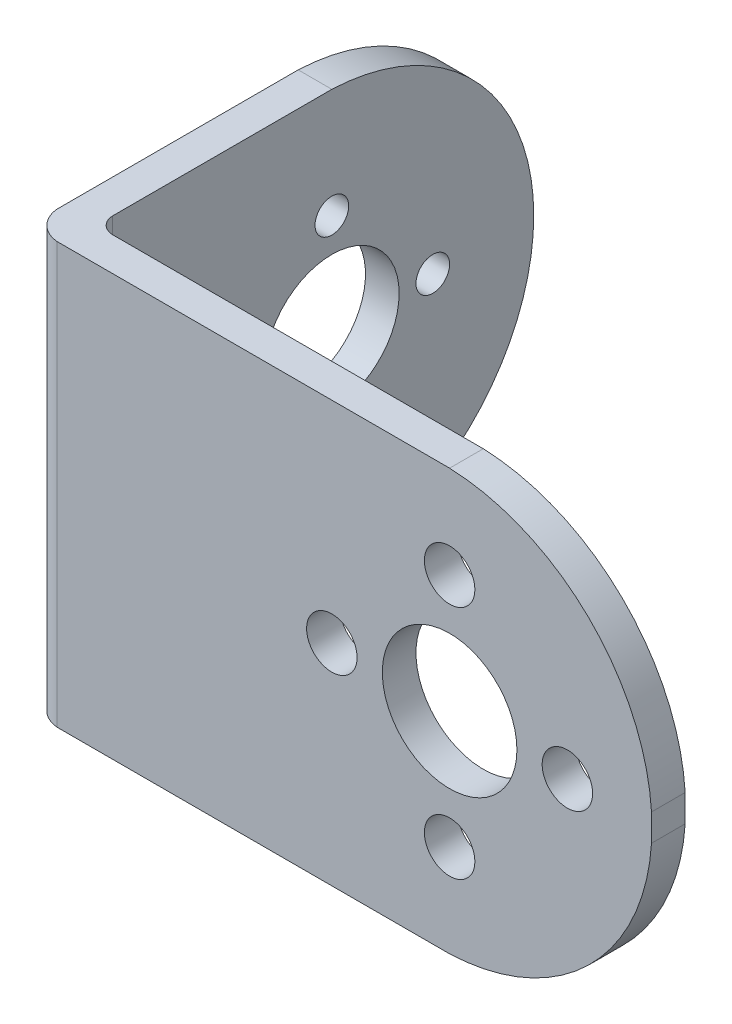
ISO-10303-21;
HEADER;
FILE_DESCRIPTION(('STEP AP214'),'2;1');
FILE_NAME('part.step','',(''),(''),'','','');
FILE_SCHEMA(('AUTOMOTIVE_DESIGN { 1 0 10303 214 1 1 1 1 }'));
ENDSEC;
DATA;
#1=APPLICATION_CONTEXT('core data for automotive mechanical design processes');
#2=APPLICATION_PROTOCOL_DEFINITION('international standard','automotive_design',2000,#1);
#3=PRODUCT_CONTEXT('',#1,'mechanical');
#4=PRODUCT('Part','Part','',(#3));
#5=PRODUCT_RELATED_PRODUCT_CATEGORY('part','',(#4));
#6=PRODUCT_DEFINITION_FORMATION('','',#4);
#7=PRODUCT_DEFINITION_CONTEXT('part definition',#1,'design');
#8=PRODUCT_DEFINITION('design','',#6,#7);
#9=PRODUCT_DEFINITION_SHAPE('','',#8);
#10=(LENGTH_UNIT() NAMED_UNIT(*) SI_UNIT(.MILLI.,.METRE.));
#11=(NAMED_UNIT(*) PLANE_ANGLE_UNIT() SI_UNIT($,.RADIAN.));
#12=(NAMED_UNIT(*) SI_UNIT($,.STERADIAN.) SOLID_ANGLE_UNIT());
#13=UNCERTAINTY_MEASURE_WITH_UNIT(LENGTH_MEASURE(1.E-05),#10,'distance_accuracy_value','');
#14=(GEOMETRIC_REPRESENTATION_CONTEXT(3) GLOBAL_UNCERTAINTY_ASSIGNED_CONTEXT((#13)) GLOBAL_UNIT_ASSIGNED_CONTEXT((#10,
#11,#12)) REPRESENTATION_CONTEXT('',''));
#15=CARTESIAN_POINT('',(0.,0.,0.));
#16=DIRECTION('',(0.,0.,1.));
#17=DIRECTION('',(1.,0.,0.));
#18=AXIS2_PLACEMENT_3D('',#15,#16,#17);
#19=CARTESIAN_POINT('',(0.,25.,0.));
#20=DIRECTION('',(0.,0.,-1.));
#21=DIRECTION('',(-1.,0.,0.));
#22=AXIS2_PLACEMENT_3D('',#19,#20,#21);
#23=PLANE('',#22);
#24=CARTESIAN_POINT('',(25.,19.5,0.));
#25=DIRECTION('',(0.,0.,1.));
#26=DIRECTION('',(1.,0.,0.));
#27=AXIS2_PLACEMENT_3D('',#24,#25,#26);
#28=CIRCLE('',#27,1.5);
#29=CARTESIAN_POINT('',(26.5,19.5,0.));
#30=VERTEX_POINT('',#29);
#31=EDGE_CURVE('E309',#30,#30,#28,.T.);
#32=ORIENTED_EDGE('',*,*,#31,.F.);
#33=EDGE_LOOP('',(#32));
#34=FACE_BOUND('',#33,.T.);
#35=CARTESIAN_POINT('',(32.0000000000001,12.5000000000001,0.));
#36=DIRECTION('',(0.,0.,1.));
#37=DIRECTION('',(1.,0.,0.));
#38=AXIS2_PLACEMENT_3D('',#35,#36,#37);
#39=CIRCLE('',#38,1.5);
#40=CARTESIAN_POINT('',(33.5000000000001,12.5000000000001,0.));
#41=VERTEX_POINT('',#40);
#42=EDGE_CURVE('E306',#41,#41,#39,.T.);
#43=ORIENTED_EDGE('',*,*,#42,.F.);
#44=EDGE_LOOP('',(#43));
#45=FACE_BOUND('',#44,.T.);
#46=CARTESIAN_POINT('',(25.0000000000002,5.5,0.));
#47=DIRECTION('',(0.,0.,1.));
#48=DIRECTION('',(1.,0.,0.));
#49=AXIS2_PLACEMENT_3D('',#46,#47,#48);
#50=CIRCLE('',#49,1.5);
#51=CARTESIAN_POINT('',(26.5000000000002,5.5,0.));
#52=VERTEX_POINT('',#51);
#53=EDGE_CURVE('E303',#52,#52,#50,.T.);
#54=ORIENTED_EDGE('',*,*,#53,.F.);
#55=EDGE_LOOP('',(#54));
#56=FACE_BOUND('',#55,.T.);
#57=CARTESIAN_POINT('',(18.0000000000001,12.5,0.));
#58=DIRECTION('',(0.,0.,1.));
#59=DIRECTION('',(1.,0.,0.));
#60=AXIS2_PLACEMENT_3D('',#57,#58,#59);
#61=CIRCLE('',#60,1.5);
#62=CARTESIAN_POINT('',(19.5000000000001,12.5,0.));
#63=VERTEX_POINT('',#62);
#64=EDGE_CURVE('E302',#63,#63,#61,.T.);
#65=ORIENTED_EDGE('',*,*,#64,.F.);
#66=EDGE_LOOP('',(#65));
#67=FACE_BOUND('',#66,.T.);
#68=CARTESIAN_POINT('',(25.,12.5,0.));
#69=DIRECTION('',(0.,0.,1.));
#70=DIRECTION('',(1.,0.,0.));
#71=AXIS2_PLACEMENT_3D('',#68,#69,#70);
#72=CIRCLE('',#71,4.);
#73=CARTESIAN_POINT('',(29.,12.5,0.));
#74=VERTEX_POINT('',#73);
#75=EDGE_CURVE('E160',#74,#74,#72,.T.);
#76=ORIENTED_EDGE('',*,*,#75,.F.);
#77=EDGE_LOOP('',(#76));
#78=FACE_BOUND('',#77,.T.);
#79=CARTESIAN_POINT('',(24.5166193979498,12.5,0.));
#80=DIRECTION('',(0.,0.,1.));
#81=DIRECTION('',(1.,0.,0.));
#82=AXIS2_PLACEMENT_3D('',#79,#80,#81);
#83=CIRCLE('',#82,12.5093427807554);
#84=CARTESIAN_POINT('',(37.,13.3055219120512,0.));
#85=VERTEX_POINT('',#84);
#86=CARTESIAN_POINT('',(25.,25.,0.));
#87=VERTEX_POINT('',#86);
#88=EDGE_CURVE('E116',#85,#87,#83,.T.);
#89=ORIENTED_EDGE('',*,*,#88,.T.);
#90=DIRECTION('',(1.,0.,0.));
#91=VECTOR('',#90,1.);
#92=CARTESIAN_POINT('',(0.,25.,0.));
#93=LINE('',#92,#91);
#94=CARTESIAN_POINT('',(1.65907540690337,25.,0.));
#95=VERTEX_POINT('',#94);
#96=EDGE_CURVE('E193',#95,#87,#93,.T.);
#97=ORIENTED_EDGE('',*,*,#96,.F.);
#98=DIRECTION('',(0.,-1.,0.));
#99=VECTOR('',#98,1.);
#100=CARTESIAN_POINT('',(1.65907540690337,25.,0.));
#101=LINE('',#100,#99);
#102=CARTESIAN_POINT('',(1.65907540690337,0.,0.));
#103=VERTEX_POINT('',#102);
#104=EDGE_CURVE('E137',#95,#103,#101,.T.);
#105=ORIENTED_EDGE('',*,*,#104,.T.);
#106=DIRECTION('',(1.,0.,0.));
#107=VECTOR('',#106,1.);
#108=CARTESIAN_POINT('',(0.,0.,0.));
#109=LINE('',#108,#107);
#110=CARTESIAN_POINT('',(25.,0.,0.));
#111=VERTEX_POINT('',#110);
#112=EDGE_CURVE('E206',#103,#111,#109,.T.);
#113=ORIENTED_EDGE('',*,*,#112,.T.);
#114=CARTESIAN_POINT('',(24.5166193979498,12.5,0.));
#115=DIRECTION('',(0.,0.,1.));
#116=DIRECTION('',(1.,0.,0.));
#117=AXIS2_PLACEMENT_3D('',#114,#115,#116);
#118=CIRCLE('',#117,12.5093427807554);
#119=CARTESIAN_POINT('',(37.,11.6944780879488,0.));
#120=VERTEX_POINT('',#119);
#121=EDGE_CURVE('E64',#111,#120,#118,.T.);
#122=ORIENTED_EDGE('',*,*,#121,.T.);
#123=DIRECTION('',(0.,-1.,0.));
#124=VECTOR('',#123,1.);
#125=CARTESIAN_POINT('',(37.,25.,0.));
#126=LINE('',#125,#124);
#127=EDGE_CURVE('E131',#85,#120,#126,.T.);
#128=ORIENTED_EDGE('',*,*,#127,.F.);
#129=EDGE_LOOP('',(#89,#97,#105,#113,#122,#128));
#130=FACE_BOUND('',#129,.T.);
#131=ADVANCED_FACE('F40',(#34,#45,#56,#67,#78,#130),#23,.F.);
#132=CARTESIAN_POINT('',(37.,25.,0.));
#133=DIRECTION('',(-1.,0.,0.));
#134=DIRECTION('',(0.,0.,1.));
#135=AXIS2_PLACEMENT_3D('',#132,#133,#134);
#136=PLANE('',#135);
#137=DIRECTION('',(0.,0.,1.));
#138=VECTOR('',#137,1.);
#139=CARTESIAN_POINT('',(37.,13.3055219120512,-25.));
#140=LINE('',#139,#138);
#141=CARTESIAN_POINT('',(37.,13.3055219120512,-2.));
#142=VERTEX_POINT('',#141);
#143=EDGE_CURVE('E119',#142,#85,#140,.T.);
#144=ORIENTED_EDGE('',*,*,#143,.T.);
#145=ORIENTED_EDGE('',*,*,#127,.T.);
#146=DIRECTION('',(0.,0.,1.));
#147=VECTOR('',#146,1.);
#148=CARTESIAN_POINT('',(37.,11.6944780879488,-25.));
#149=LINE('',#148,#147);
#150=CARTESIAN_POINT('',(37.,11.6944780879488,-2.));
#151=VERTEX_POINT('',#150);
#152=EDGE_CURVE('E124',#151,#120,#149,.T.);
#153=ORIENTED_EDGE('',*,*,#152,.F.);
#154=DIRECTION('',(0.,-1.,0.));
#155=VECTOR('',#154,1.);
#156=CARTESIAN_POINT('',(37.,25.,-2.));
#157=LINE('',#156,#155);
#158=EDGE_CURVE('E133',#142,#151,#157,.T.);
#159=ORIENTED_EDGE('',*,*,#158,.F.);
#160=EDGE_LOOP('',(#144,#145,#153,#159));
#161=FACE_BOUND('',#160,.T.);
#162=ADVANCED_FACE('F129',(#161),#136,.F.);
#163=CARTESIAN_POINT('',(0.,25.,-2.));
#164=DIRECTION('',(0.,0.,1.));
#165=DIRECTION('',(1.,0.,0.));
#166=AXIS2_PLACEMENT_3D('',#163,#164,#165);
#167=PLANE('',#166);
#168=CARTESIAN_POINT('',(25.,19.5,-2.));
#169=DIRECTION('',(0.,0.,1.));
#170=DIRECTION('',(1.,0.,0.));
#171=AXIS2_PLACEMENT_3D('',#168,#169,#170);
#172=CIRCLE('',#171,1.5);
#173=CARTESIAN_POINT('',(26.5,19.5,-2.));
#174=VERTEX_POINT('',#173);
#175=EDGE_CURVE('E44',#174,#174,#172,.T.);
#176=ORIENTED_EDGE('',*,*,#175,.T.);
#177=EDGE_LOOP('',(#176));
#178=FACE_BOUND('',#177,.T.);
#179=CARTESIAN_POINT('',(32.0000000000001,12.5000000000001,-2.));
#180=DIRECTION('',(0.,0.,1.));
#181=DIRECTION('',(1.,0.,0.));
#182=AXIS2_PLACEMENT_3D('',#179,#180,#181);
#183=CIRCLE('',#182,1.5);
#184=CARTESIAN_POINT('',(33.5000000000001,12.5000000000001,-2.));
#185=VERTEX_POINT('',#184);
#186=EDGE_CURVE('E165',#185,#185,#183,.T.);
#187=ORIENTED_EDGE('',*,*,#186,.T.);
#188=EDGE_LOOP('',(#187));
#189=FACE_BOUND('',#188,.T.);
#190=CARTESIAN_POINT('',(25.0000000000002,5.5,-2.));
#191=DIRECTION('',(0.,0.,1.));
#192=DIRECTION('',(1.,0.,0.));
#193=AXIS2_PLACEMENT_3D('',#190,#191,#192);
#194=CIRCLE('',#193,1.5);
#195=CARTESIAN_POINT('',(26.5000000000002,5.5,-2.));
#196=VERTEX_POINT('',#195);
#197=EDGE_CURVE('E163',#196,#196,#194,.T.);
#198=ORIENTED_EDGE('',*,*,#197,.T.);
#199=EDGE_LOOP('',(#198));
#200=FACE_BOUND('',#199,.T.);
#201=CARTESIAN_POINT('',(18.0000000000001,12.5,-2.));
#202=DIRECTION('',(0.,0.,1.));
#203=DIRECTION('',(1.,0.,0.));
#204=AXIS2_PLACEMENT_3D('',#201,#202,#203);
#205=CIRCLE('',#204,1.5);
#206=CARTESIAN_POINT('',(19.5000000000001,12.5,-2.));
#207=VERTEX_POINT('',#206);
#208=EDGE_CURVE('E159',#207,#207,#205,.T.);
#209=ORIENTED_EDGE('',*,*,#208,.T.);
#210=EDGE_LOOP('',(#209));
#211=FACE_BOUND('',#210,.T.);
#212=CARTESIAN_POINT('',(25.,12.5,-2.));
#213=DIRECTION('',(0.,0.,1.));
#214=DIRECTION('',(1.,0.,0.));
#215=AXIS2_PLACEMENT_3D('',#212,#213,#214);
#216=CIRCLE('',#215,4.);
#217=CARTESIAN_POINT('',(29.,12.5,-2.));
#218=VERTEX_POINT('',#217);
#219=EDGE_CURVE('E156',#218,#218,#216,.T.);
#220=ORIENTED_EDGE('',*,*,#219,.T.);
#221=EDGE_LOOP('',(#220));
#222=FACE_BOUND('',#221,.T.);
#223=CARTESIAN_POINT('',(24.5166193979498,12.5,-2.));
#224=DIRECTION('',(0.,0.,1.));
#225=DIRECTION('',(1.,0.,0.));
#226=AXIS2_PLACEMENT_3D('',#223,#224,#225);
#227=CIRCLE('',#226,12.5093427807554);
#228=CARTESIAN_POINT('',(25.,25.,-2.));
#229=VERTEX_POINT('',#228);
#230=EDGE_CURVE('E57',#142,#229,#227,.T.);
#231=ORIENTED_EDGE('',*,*,#230,.F.);
#232=ORIENTED_EDGE('',*,*,#158,.T.);
#233=CARTESIAN_POINT('',(24.5166193979498,12.5,-2.));
#234=DIRECTION('',(0.,0.,1.));
#235=DIRECTION('',(1.,0.,0.));
#236=AXIS2_PLACEMENT_3D('',#233,#234,#235);
#237=CIRCLE('',#236,12.5093427807554);
#238=CARTESIAN_POINT('',(25.,0.,-2.));
#239=VERTEX_POINT('',#238);
#240=EDGE_CURVE('E134',#239,#151,#237,.T.);
#241=ORIENTED_EDGE('',*,*,#240,.F.);
#242=DIRECTION('',(-1.,0.,0.));
#243=VECTOR('',#242,1.);
#244=CARTESIAN_POINT('',(0.,0.,-2.));
#245=LINE('',#244,#243);
#246=CARTESIAN_POINT('',(3.03872971417256,0.,-2.));
#247=VERTEX_POINT('',#246);
#248=EDGE_CURVE('E186',#239,#247,#245,.T.);
#249=ORIENTED_EDGE('',*,*,#248,.T.);
#250=DIRECTION('',(0.,-1.,0.));
#251=VECTOR('',#250,1.);
#252=CARTESIAN_POINT('',(3.03872971417256,25.,-2.));
#253=LINE('',#252,#251);
#254=CARTESIAN_POINT('',(3.03872971417256,25.,-2.));
#255=VERTEX_POINT('',#254);
#256=EDGE_CURVE('E142',#255,#247,#253,.T.);
#257=ORIENTED_EDGE('',*,*,#256,.F.);
#258=DIRECTION('',(-1.,0.,0.));
#259=VECTOR('',#258,1.);
#260=CARTESIAN_POINT('',(0.,25.,-2.));
#261=LINE('',#260,#259);
#262=EDGE_CURVE('E195',#229,#255,#261,.T.);
#263=ORIENTED_EDGE('',*,*,#262,.F.);
#264=EDGE_LOOP('',(#231,#232,#241,#249,#257,#263));
#265=FACE_BOUND('',#264,.T.);
#266=ADVANCED_FACE('F228',(#178,#189,#200,#211,#222,#265),#167,.F.);
#267=CARTESIAN_POINT('',(0.,25.,0.));
#268=DIRECTION('',(0.,1.,0.));
#269=DIRECTION('',(0.,0.,1.));
#270=AXIS2_PLACEMENT_3D('',#267,#268,#269);
#271=PLANE('',#270);
#272=ORIENTED_EDGE('',*,*,#96,.T.);
#273=DIRECTION('',(0.,0.,1.));
#274=VECTOR('',#273,1.);
#275=CARTESIAN_POINT('',(25.,25.,-25.));
#276=LINE('',#275,#274);
#277=EDGE_CURVE('E12',#87,#229,#276,.F.);
#278=ORIENTED_EDGE('',*,*,#277,.T.);
#279=ORIENTED_EDGE('',*,*,#262,.T.);
#280=CARTESIAN_POINT('',(3.00314791089518,25.,-3.00314791089518));
#281=DIRECTION('',(0.,1.,0.));
#282=DIRECTION('',(0.,0.,1.));
#283=AXIS2_PLACEMENT_3D('',#280,#281,#282);
#284=CIRCLE('',#283,1.00377875842132);
#285=CARTESIAN_POINT('',(2.,25.,-2.9675661076178));
#286=VERTEX_POINT('',#285);
#287=EDGE_CURVE('E182',#286,#255,#284,.T.);
#288=ORIENTED_EDGE('',*,*,#287,.F.);
#289=DIRECTION('',(0.,0.,1.));
#290=VECTOR('',#289,1.);
#291=CARTESIAN_POINT('',(2.,25.,0.));
#292=LINE('',#291,#290);
#293=CARTESIAN_POINT('',(2.,25.,-16.));
#294=VERTEX_POINT('',#293);
#295=EDGE_CURVE('E185',#294,#286,#292,.T.);
#296=ORIENTED_EDGE('',*,*,#295,.F.);
#297=DIRECTION('',(-1.,0.,0.));
#298=VECTOR('',#297,1.);
#299=CARTESIAN_POINT('',(25.,25.,-16.));
#300=LINE('',#299,#298);
#301=CARTESIAN_POINT('',(0.,25.,-16.));
#302=VERTEX_POINT('',#301);
#303=EDGE_CURVE('E150',#302,#294,#300,.F.);
#304=ORIENTED_EDGE('',*,*,#303,.F.);
#305=DIRECTION('',(0.,0.,-1.));
#306=VECTOR('',#305,1.);
#307=CARTESIAN_POINT('',(0.,25.,0.));
#308=LINE('',#307,#306);
#309=CARTESIAN_POINT('',(0.,25.,-1.65907540690337));
#310=VERTEX_POINT('',#309);
#311=EDGE_CURVE('E188',#310,#302,#308,.T.);
#312=ORIENTED_EDGE('',*,*,#311,.F.);
#313=CARTESIAN_POINT('',(1.82953770345169,25.,-1.82953770345169));
#314=DIRECTION('',(0.,1.,0.));
#315=DIRECTION('',(0.,0.,1.));
#316=AXIS2_PLACEMENT_3D('',#313,#314,#315);
#317=CIRCLE('',#316,1.83746172828056);
#318=EDGE_CURVE('E191',#310,#95,#317,.T.);
#319=ORIENTED_EDGE('',*,*,#318,.T.);
#320=EDGE_LOOP('',(#272,#278,#279,#288,#296,#304,#312,#319));
#321=FACE_BOUND('',#320,.T.);
#322=ADVANCED_FACE('F226',(#321),#271,.T.);
#323=CARTESIAN_POINT('',(0.,0.,0.));
#324=DIRECTION('',(0.,1.,0.));
#325=DIRECTION('',(0.,0.,1.));
#326=AXIS2_PLACEMENT_3D('',#323,#324,#325);
#327=PLANE('',#326);
#328=DIRECTION('',(0.,0.,1.));
#329=VECTOR('',#328,1.);
#330=CARTESIAN_POINT('',(25.,0.,-25.));
#331=LINE('',#330,#329);
#332=EDGE_CURVE('E49',#111,#239,#331,.F.);
#333=ORIENTED_EDGE('',*,*,#332,.F.);
#334=ORIENTED_EDGE('',*,*,#112,.F.);
#335=CARTESIAN_POINT('',(1.82953770345169,0.,-1.82953770345169));
#336=DIRECTION('',(0.,1.,0.));
#337=DIRECTION('',(0.,0.,1.));
#338=AXIS2_PLACEMENT_3D('',#335,#336,#337);
#339=CIRCLE('',#338,1.83746172828056);
#340=CARTESIAN_POINT('',(0.,0.,-1.65907540690337));
#341=VERTEX_POINT('',#340);
#342=EDGE_CURVE('E204',#341,#103,#339,.T.);
#343=ORIENTED_EDGE('',*,*,#342,.F.);
#344=DIRECTION('',(0.,0.,-1.));
#345=VECTOR('',#344,1.);
#346=CARTESIAN_POINT('',(0.,0.,0.));
#347=LINE('',#346,#345);
#348=CARTESIAN_POINT('',(0.,0.,-16.));
#349=VERTEX_POINT('',#348);
#350=EDGE_CURVE('E201',#341,#349,#347,.T.);
#351=ORIENTED_EDGE('',*,*,#350,.T.);
#352=DIRECTION('',(-1.,0.,0.));
#353=VECTOR('',#352,1.);
#354=CARTESIAN_POINT('',(25.,0.,-16.));
#355=LINE('',#354,#353);
#356=CARTESIAN_POINT('',(2.,0.,-16.));
#357=VERTEX_POINT('',#356);
#358=EDGE_CURVE('E152',#349,#357,#355,.F.);
#359=ORIENTED_EDGE('',*,*,#358,.T.);
#360=DIRECTION('',(0.,0.,1.));
#361=VECTOR('',#360,1.);
#362=CARTESIAN_POINT('',(2.,0.,0.));
#363=LINE('',#362,#361);
#364=CARTESIAN_POINT('',(2.,0.,-2.9675661076178));
#365=VERTEX_POINT('',#364);
#366=EDGE_CURVE('E199',#357,#365,#363,.T.);
#367=ORIENTED_EDGE('',*,*,#366,.T.);
#368=CARTESIAN_POINT('',(3.00314791089518,0.,-3.00314791089518));
#369=DIRECTION('',(0.,1.,0.));
#370=DIRECTION('',(0.,0.,1.));
#371=AXIS2_PLACEMENT_3D('',#368,#369,#370);
#372=CIRCLE('',#371,1.00377875842132);
#373=EDGE_CURVE('E181',#365,#247,#372,.T.);
#374=ORIENTED_EDGE('',*,*,#373,.T.);
#375=ORIENTED_EDGE('',*,*,#248,.F.);
#376=EDGE_LOOP('',(#333,#334,#343,#351,#359,#367,#374,#375));
#377=FACE_BOUND('',#376,.T.);
#378=ADVANCED_FACE('F218',(#377),#327,.F.);
#379=CARTESIAN_POINT('',(2.,25.,0.));
#380=DIRECTION('',(1.,0.,0.));
#381=DIRECTION('',(0.,0.,-1.));
#382=AXIS2_PLACEMENT_3D('',#379,#380,#381);
#383=PLANE('',#382);
#384=CARTESIAN_POINT('',(2.,18.5,-16.));
#385=DIRECTION('',(1.,0.,0.));
#386=DIRECTION('',(0.,0.,-1.));
#387=AXIS2_PLACEMENT_3D('',#384,#385,#386);
#388=CIRCLE('',#387,1.);
#389=CARTESIAN_POINT('',(2.,18.5,-17.));
#390=VERTEX_POINT('',#389);
#391=EDGE_CURVE('E274',#390,#390,#388,.T.);
#392=ORIENTED_EDGE('',*,*,#391,.F.);
#393=EDGE_LOOP('',(#392));
#394=FACE_BOUND('',#393,.T.);
#395=CARTESIAN_POINT('',(2.,12.5000000000001,-9.99999999999991));
#396=DIRECTION('',(1.,0.,0.));
#397=DIRECTION('',(0.,0.,-1.));
#398=AXIS2_PLACEMENT_3D('',#395,#396,#397);
#399=CIRCLE('',#398,1.);
#400=CARTESIAN_POINT('',(2.,12.5000000000001,-10.9999999999999));
#401=VERTEX_POINT('',#400);
#402=EDGE_CURVE('E278',#401,#401,#399,.T.);
#403=ORIENTED_EDGE('',*,*,#402,.F.);
#404=EDGE_LOOP('',(#403));
#405=FACE_BOUND('',#404,.T.);
#406=CARTESIAN_POINT('',(2.,6.5,-15.9999999999999));
#407=DIRECTION('',(1.,0.,0.));
#408=DIRECTION('',(0.,0.,-1.));
#409=AXIS2_PLACEMENT_3D('',#406,#407,#408);
#410=CIRCLE('',#409,1.);
#411=CARTESIAN_POINT('',(2.,6.5,-16.9999999999999));
#412=VERTEX_POINT('',#411);
#413=EDGE_CURVE('E282',#412,#412,#410,.T.);
#414=ORIENTED_EDGE('',*,*,#413,.F.);
#415=EDGE_LOOP('',(#414));
#416=FACE_BOUND('',#415,.T.);
#417=CARTESIAN_POINT('',(2.,12.5,-21.9999999999999));
#418=DIRECTION('',(1.,0.,0.));
#419=DIRECTION('',(0.,0.,-1.));
#420=AXIS2_PLACEMENT_3D('',#417,#418,#419);
#421=CIRCLE('',#420,0.999999999999999);
#422=CARTESIAN_POINT('',(2.,12.5,-22.9999999999999));
#423=VERTEX_POINT('',#422);
#424=EDGE_CURVE('E286',#423,#423,#421,.T.);
#425=ORIENTED_EDGE('',*,*,#424,.F.);
#426=EDGE_LOOP('',(#425));
#427=FACE_BOUND('',#426,.T.);
#428=CARTESIAN_POINT('',(2.,12.5,-16.));
#429=DIRECTION('',(1.,0.,0.));
#430=DIRECTION('',(0.,0.,-1.));
#431=AXIS2_PLACEMENT_3D('',#428,#429,#430);
#432=CIRCLE('',#431,4.);
#433=CARTESIAN_POINT('',(2.,12.5,-20.));
#434=VERTEX_POINT('',#433);
#435=EDGE_CURVE('E289',#434,#434,#432,.T.);
#436=ORIENTED_EDGE('',*,*,#435,.F.);
#437=EDGE_LOOP('',(#436));
#438=FACE_BOUND('',#437,.T.);
#439=ORIENTED_EDGE('',*,*,#366,.F.);
#440=CARTESIAN_POINT('',(2.,12.5,-15.4895833333333));
#441=DIRECTION('',(1.,0.,0.));
#442=DIRECTION('',(0.,0.,-1.));
#443=AXIS2_PLACEMENT_3D('',#440,#441,#442);
#444=CIRCLE('',#443,12.5104166666667);
#445=EDGE_CURVE('E179',#294,#357,#444,.F.);
#446=ORIENTED_EDGE('',*,*,#445,.F.);
#447=ORIENTED_EDGE('',*,*,#295,.T.);
#448=DIRECTION('',(0.,-1.,0.));
#449=VECTOR('',#448,1.);
#450=CARTESIAN_POINT('',(2.,25.,-2.9675661076178));
#451=LINE('',#450,#449);
#452=EDGE_CURVE('E147',#286,#365,#451,.T.);
#453=ORIENTED_EDGE('',*,*,#452,.T.);
#454=EDGE_LOOP('',(#439,#446,#447,#453));
#455=FACE_BOUND('',#454,.T.);
#456=ADVANCED_FACE('F223',(#394,#405,#416,#427,#438,#455),#383,.T.);
#457=CARTESIAN_POINT('',(0.,25.,0.));
#458=DIRECTION('',(-1.,0.,0.));
#459=DIRECTION('',(0.,0.,1.));
#460=AXIS2_PLACEMENT_3D('',#457,#458,#459);
#461=PLANE('',#460);
#462=CARTESIAN_POINT('',(0.,18.5,-16.));
#463=DIRECTION('',(-1.,0.,0.));
#464=DIRECTION('',(0.,0.,1.));
#465=AXIS2_PLACEMENT_3D('',#462,#463,#464);
#466=CIRCLE('',#465,1.);
#467=CARTESIAN_POINT('',(0.,18.5,-15.));
#468=VERTEX_POINT('',#467);
#469=EDGE_CURVE('E295',#468,#468,#466,.T.);
#470=ORIENTED_EDGE('',*,*,#469,.F.);
#471=EDGE_LOOP('',(#470));
#472=FACE_BOUND('',#471,.T.);
#473=CARTESIAN_POINT('',(0.,12.5000000000001,-9.99999999999991));
#474=DIRECTION('',(-1.,0.,0.));
#475=DIRECTION('',(0.,0.,1.));
#476=AXIS2_PLACEMENT_3D('',#473,#474,#475);
#477=CIRCLE('',#476,1.);
#478=CARTESIAN_POINT('',(0.,12.5000000000001,-8.99999999999991));
#479=VERTEX_POINT('',#478);
#480=EDGE_CURVE('E454',#479,#479,#477,.T.);
#481=ORIENTED_EDGE('',*,*,#480,.F.);
#482=EDGE_LOOP('',(#481));
#483=FACE_BOUND('',#482,.T.);
#484=CARTESIAN_POINT('',(0.,6.5,-15.9999999999999));
#485=DIRECTION('',(-1.,0.,0.));
#486=DIRECTION('',(0.,0.,1.));
#487=AXIS2_PLACEMENT_3D('',#484,#485,#486);
#488=CIRCLE('',#487,1.);
#489=CARTESIAN_POINT('',(0.,6.5,-14.9999999999999));
#490=VERTEX_POINT('',#489);
#491=EDGE_CURVE('E457',#490,#490,#488,.T.);
#492=ORIENTED_EDGE('',*,*,#491,.F.);
#493=EDGE_LOOP('',(#492));
#494=FACE_BOUND('',#493,.T.);
#495=CARTESIAN_POINT('',(0.,12.5,-21.9999999999999));
#496=DIRECTION('',(-1.,0.,0.));
#497=DIRECTION('',(0.,0.,1.));
#498=AXIS2_PLACEMENT_3D('',#495,#496,#497);
#499=CIRCLE('',#498,0.999999999999999);
#500=CARTESIAN_POINT('',(0.,12.5,-20.9999999999999));
#501=VERTEX_POINT('',#500);
#502=EDGE_CURVE('E459',#501,#501,#499,.T.);
#503=ORIENTED_EDGE('',*,*,#502,.F.);
#504=EDGE_LOOP('',(#503));
#505=FACE_BOUND('',#504,.T.);
#506=CARTESIAN_POINT('',(0.,12.5,-16.));
#507=DIRECTION('',(-1.,0.,0.));
#508=DIRECTION('',(0.,0.,1.));
#509=AXIS2_PLACEMENT_3D('',#506,#507,#508);
#510=CIRCLE('',#509,4.);
#511=CARTESIAN_POINT('',(0.,12.5,-12.));
#512=VERTEX_POINT('',#511);
#513=EDGE_CURVE('E291',#512,#512,#510,.T.);
#514=ORIENTED_EDGE('',*,*,#513,.F.);
#515=EDGE_LOOP('',(#514));
#516=FACE_BOUND('',#515,.T.);
#517=CARTESIAN_POINT('',(0.,12.5,-15.4895833333333));
#518=DIRECTION('',(-1.,0.,0.));
#519=DIRECTION('',(0.,0.,1.));
#520=AXIS2_PLACEMENT_3D('',#517,#518,#519);
#521=CIRCLE('',#520,12.5104166666667);
#522=EDGE_CURVE('E177',#349,#302,#521,.F.);
#523=ORIENTED_EDGE('',*,*,#522,.F.);
#524=ORIENTED_EDGE('',*,*,#350,.F.);
#525=DIRECTION('',(0.,-1.,0.));
#526=VECTOR('',#525,1.);
#527=CARTESIAN_POINT('',(0.,25.,-1.65907540690337));
#528=LINE('',#527,#526);
#529=EDGE_CURVE('E140',#310,#341,#528,.T.);
#530=ORIENTED_EDGE('',*,*,#529,.F.);
#531=ORIENTED_EDGE('',*,*,#311,.T.);
#532=EDGE_LOOP('',(#523,#524,#530,#531));
#533=FACE_BOUND('',#532,.T.);
#534=ADVANCED_FACE('F240',(#472,#483,#494,#505,#516,#533),#461,.T.);
#535=CARTESIAN_POINT('',(3.00314791089518,25.,-3.00314791089518));
#536=DIRECTION('',(0.,-1.,0.));
#537=DIRECTION('',(0.,0.,-1.));
#538=AXIS2_PLACEMENT_3D('',#535,#536,#537);
#539=CYLINDRICAL_SURFACE('',#538,1.00377875842132);
#540=ORIENTED_EDGE('',*,*,#373,.F.);
#541=ORIENTED_EDGE('',*,*,#452,.F.);
#542=ORIENTED_EDGE('',*,*,#287,.T.);
#543=ORIENTED_EDGE('',*,*,#256,.T.);
#544=EDGE_LOOP('',(#540,#541,#542,#543));
#545=FACE_BOUND('',#544,.T.);
#546=ADVANCED_FACE('F42',(#545),#539,.F.);
#547=CARTESIAN_POINT('',(1.82953770345169,25.,-1.82953770345169));
#548=DIRECTION('',(0.,-1.,0.));
#549=DIRECTION('',(0.,0.,-1.));
#550=AXIS2_PLACEMENT_3D('',#547,#548,#549);
#551=CYLINDRICAL_SURFACE('',#550,1.83746172828056);
#552=ORIENTED_EDGE('',*,*,#342,.T.);
#553=ORIENTED_EDGE('',*,*,#104,.F.);
#554=ORIENTED_EDGE('',*,*,#318,.F.);
#555=ORIENTED_EDGE('',*,*,#529,.T.);
#556=EDGE_LOOP('',(#552,#553,#554,#555));
#557=FACE_BOUND('',#556,.T.);
#558=ADVANCED_FACE('F236',(#557),#551,.T.);
#559=CARTESIAN_POINT('',(25.,12.5,-15.4895833333333));
#560=DIRECTION('',(-1.,0.,0.));
#561=DIRECTION('',(0.,0.,1.));
#562=AXIS2_PLACEMENT_3D('',#559,#560,#561);
#563=CYLINDRICAL_SURFACE('',#562,12.5104166666667);
#564=ORIENTED_EDGE('',*,*,#445,.T.);
#565=ORIENTED_EDGE('',*,*,#358,.F.);
#566=ORIENTED_EDGE('',*,*,#522,.T.);
#567=ORIENTED_EDGE('',*,*,#303,.T.);
#568=EDGE_LOOP('',(#564,#565,#566,#567));
#569=FACE_BOUND('',#568,.T.);
#570=ADVANCED_FACE('F242',(#569),#563,.T.);
#571=CARTESIAN_POINT('',(24.5166193979498,12.5,-25.));
#572=DIRECTION('',(0.,0.,1.));
#573=DIRECTION('',(1.,0.,0.));
#574=AXIS2_PLACEMENT_3D('',#571,#572,#573);
#575=CYLINDRICAL_SURFACE('',#574,12.5093427807554);
#576=ORIENTED_EDGE('',*,*,#240,.T.);
#577=ORIENTED_EDGE('',*,*,#152,.T.);
#578=ORIENTED_EDGE('',*,*,#121,.F.);
#579=ORIENTED_EDGE('',*,*,#332,.T.);
#580=EDGE_LOOP('',(#576,#577,#578,#579));
#581=FACE_BOUND('',#580,.T.);
#582=ADVANCED_FACE('F230',(#581),#575,.T.);
#583=CARTESIAN_POINT('',(24.5166193979498,12.5,-25.));
#584=DIRECTION('',(0.,0.,1.));
#585=DIRECTION('',(1.,0.,0.));
#586=AXIS2_PLACEMENT_3D('',#583,#584,#585);
#587=CYLINDRICAL_SURFACE('',#586,12.5093427807554);
#588=ORIENTED_EDGE('',*,*,#230,.T.);
#589=ORIENTED_EDGE('',*,*,#277,.F.);
#590=ORIENTED_EDGE('',*,*,#88,.F.);
#591=ORIENTED_EDGE('',*,*,#143,.F.);
#592=EDGE_LOOP('',(#588,#589,#590,#591));
#593=FACE_BOUND('',#592,.T.);
#594=ADVANCED_FACE('F118',(#593),#587,.T.);
#595=CARTESIAN_POINT('',(25.,12.5,-25.));
#596=DIRECTION('',(0.,0.,1.));
#597=DIRECTION('',(1.,0.,0.));
#598=AXIS2_PLACEMENT_3D('',#595,#596,#597);
#599=CYLINDRICAL_SURFACE('',#598,4.);
#600=ORIENTED_EDGE('',*,*,#75,.T.);
#601=EDGE_LOOP('',(#600));
#602=FACE_BOUND('',#601,.T.);
#603=ORIENTED_EDGE('',*,*,#219,.F.);
#604=EDGE_LOOP('',(#603));
#605=FACE_BOUND('',#604,.T.);
#606=ADVANCED_FACE('F317',(#602,#605),#599,.F.);
#607=CARTESIAN_POINT('',(18.0000000000001,12.5,-25.));
#608=DIRECTION('',(0.,0.,1.));
#609=DIRECTION('',(1.,0.,0.));
#610=AXIS2_PLACEMENT_3D('',#607,#608,#609);
#611=CYLINDRICAL_SURFACE('',#610,1.5);
#612=ORIENTED_EDGE('',*,*,#64,.T.);
#613=EDGE_LOOP('',(#612));
#614=FACE_BOUND('',#613,.T.);
#615=ORIENTED_EDGE('',*,*,#208,.F.);
#616=EDGE_LOOP('',(#615));
#617=FACE_BOUND('',#616,.T.);
#618=ADVANCED_FACE('F321',(#614,#617),#611,.F.);
#619=CARTESIAN_POINT('',(25.0000000000002,5.5,-25.));
#620=DIRECTION('',(0.,0.,1.));
#621=DIRECTION('',(1.,0.,0.));
#622=AXIS2_PLACEMENT_3D('',#619,#620,#621);
#623=CYLINDRICAL_SURFACE('',#622,1.5);
#624=ORIENTED_EDGE('',*,*,#53,.T.);
#625=EDGE_LOOP('',(#624));
#626=FACE_BOUND('',#625,.T.);
#627=ORIENTED_EDGE('',*,*,#197,.F.);
#628=EDGE_LOOP('',(#627));
#629=FACE_BOUND('',#628,.T.);
#630=ADVANCED_FACE('F335',(#626,#629),#623,.F.);
#631=CARTESIAN_POINT('',(32.0000000000001,12.5000000000001,-25.));
#632=DIRECTION('',(0.,0.,1.));
#633=DIRECTION('',(1.,0.,0.));
#634=AXIS2_PLACEMENT_3D('',#631,#632,#633);
#635=CYLINDRICAL_SURFACE('',#634,1.5);
#636=ORIENTED_EDGE('',*,*,#42,.T.);
#637=EDGE_LOOP('',(#636));
#638=FACE_BOUND('',#637,.T.);
#639=ORIENTED_EDGE('',*,*,#186,.F.);
#640=EDGE_LOOP('',(#639));
#641=FACE_BOUND('',#640,.T.);
#642=ADVANCED_FACE('F341',(#638,#641),#635,.F.);
#643=CARTESIAN_POINT('',(25.,19.5,-25.));
#644=DIRECTION('',(0.,0.,1.));
#645=DIRECTION('',(1.,0.,0.));
#646=AXIS2_PLACEMENT_3D('',#643,#644,#645);
#647=CYLINDRICAL_SURFACE('',#646,1.5);
#648=ORIENTED_EDGE('',*,*,#31,.T.);
#649=EDGE_LOOP('',(#648));
#650=FACE_BOUND('',#649,.T.);
#651=ORIENTED_EDGE('',*,*,#175,.F.);
#652=EDGE_LOOP('',(#651));
#653=FACE_BOUND('',#652,.T.);
#654=ADVANCED_FACE('F346',(#650,#653),#647,.F.);
#655=CARTESIAN_POINT('',(25.,12.5,-16.));
#656=DIRECTION('',(-1.,0.,0.));
#657=DIRECTION('',(0.,0.,1.));
#658=AXIS2_PLACEMENT_3D('',#655,#656,#657);
#659=CYLINDRICAL_SURFACE('',#658,4.);
#660=ORIENTED_EDGE('',*,*,#435,.T.);
#661=EDGE_LOOP('',(#660));
#662=FACE_BOUND('',#661,.T.);
#663=ORIENTED_EDGE('',*,*,#513,.T.);
#664=EDGE_LOOP('',(#663));
#665=FACE_BOUND('',#664,.T.);
#666=ADVANCED_FACE('F349',(#662,#665),#659,.F.);
#667=CARTESIAN_POINT('',(25.,12.5,-21.9999999999999));
#668=DIRECTION('',(-1.,0.,0.));
#669=DIRECTION('',(0.,0.,1.));
#670=AXIS2_PLACEMENT_3D('',#667,#668,#669);
#671=CYLINDRICAL_SURFACE('',#670,0.999999999999999);
#672=ORIENTED_EDGE('',*,*,#424,.T.);
#673=EDGE_LOOP('',(#672));
#674=FACE_BOUND('',#673,.T.);
#675=ORIENTED_EDGE('',*,*,#502,.T.);
#676=EDGE_LOOP('',(#675));
#677=FACE_BOUND('',#676,.T.);
#678=ADVANCED_FACE('F409',(#674,#677),#671,.F.);
#679=CARTESIAN_POINT('',(25.,6.5,-15.9999999999999));
#680=DIRECTION('',(-1.,0.,0.));
#681=DIRECTION('',(0.,0.,1.));
#682=AXIS2_PLACEMENT_3D('',#679,#680,#681);
#683=CYLINDRICAL_SURFACE('',#682,1.);
#684=ORIENTED_EDGE('',*,*,#413,.T.);
#685=EDGE_LOOP('',(#684));
#686=FACE_BOUND('',#685,.T.);
#687=ORIENTED_EDGE('',*,*,#491,.T.);
#688=EDGE_LOOP('',(#687));
#689=FACE_BOUND('',#688,.T.);
#690=ADVANCED_FACE('F417',(#686,#689),#683,.F.);
#691=CARTESIAN_POINT('',(25.,12.5000000000001,-9.99999999999991));
#692=DIRECTION('',(-1.,0.,0.));
#693=DIRECTION('',(0.,0.,1.));
#694=AXIS2_PLACEMENT_3D('',#691,#692,#693);
#695=CYLINDRICAL_SURFACE('',#694,1.);
#696=ORIENTED_EDGE('',*,*,#402,.T.);
#697=EDGE_LOOP('',(#696));
#698=FACE_BOUND('',#697,.T.);
#699=ORIENTED_EDGE('',*,*,#480,.T.);
#700=EDGE_LOOP('',(#699));
#701=FACE_BOUND('',#700,.T.);
#702=ADVANCED_FACE('F427',(#698,#701),#695,.F.);
#703=CARTESIAN_POINT('',(25.,18.5,-16.));
#704=DIRECTION('',(-1.,0.,0.));
#705=DIRECTION('',(0.,0.,1.));
#706=AXIS2_PLACEMENT_3D('',#703,#704,#705);
#707=CYLINDRICAL_SURFACE('',#706,1.);
#708=ORIENTED_EDGE('',*,*,#391,.T.);
#709=EDGE_LOOP('',(#708));
#710=FACE_BOUND('',#709,.T.);
#711=ORIENTED_EDGE('',*,*,#469,.T.);
#712=EDGE_LOOP('',(#711));
#713=FACE_BOUND('',#712,.T.);
#714=ADVANCED_FACE('F437',(#710,#713),#707,.F.);
#715=CLOSED_SHELL('',(#131,#162,#266,#322,#378,#456,#534,#546,#558,#570,#582,#594,#606,#618,
#630,#642,#654,#666,#678,#690,#702,#714));
#716=MANIFOLD_SOLID_BREP('B2',#715);
#717=ADVANCED_BREP_SHAPE_REPRESENTATION('',(#18,#716),#14);
#718=SHAPE_DEFINITION_REPRESENTATION(#9,#717);
ENDSEC;
END-ISO-10303-21;
